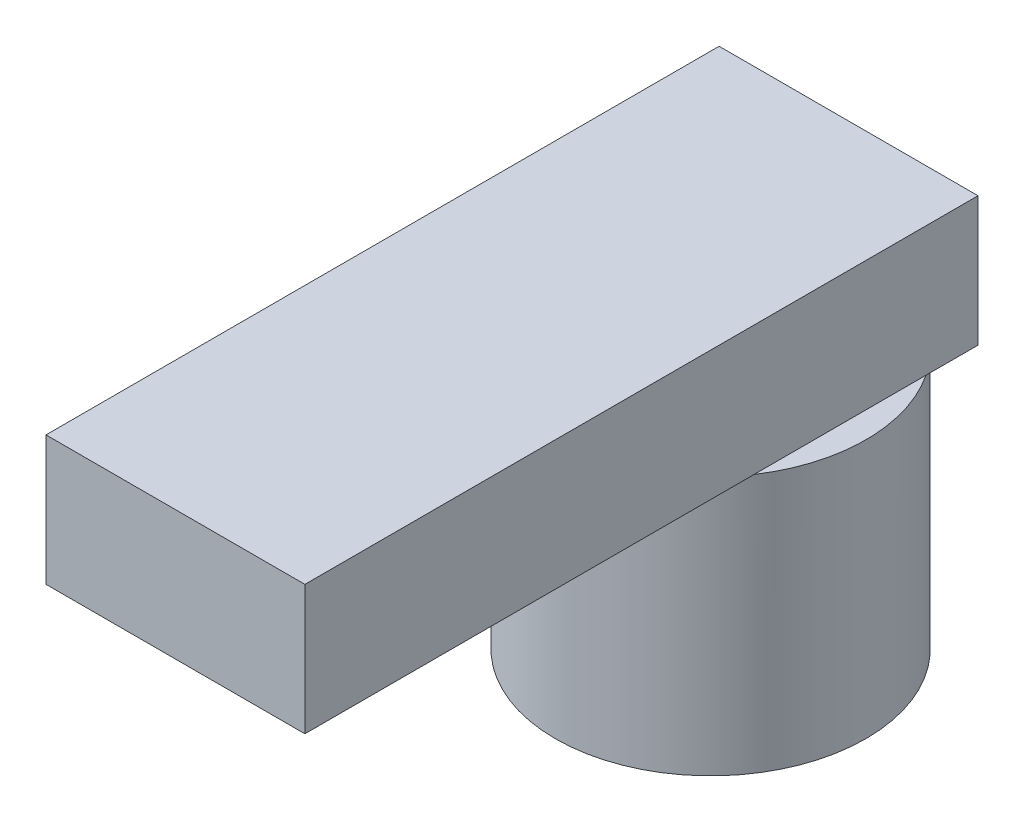
ISO-10303-21;
HEADER;
FILE_DESCRIPTION(('STEP AP214'),'2;1');
FILE_NAME('part.step','',(''),(''),'','','');
FILE_SCHEMA(('AUTOMOTIVE_DESIGN { 1 0 10303 214 1 1 1 1 }'));
ENDSEC;
DATA;
#1=APPLICATION_CONTEXT('core data for automotive mechanical design processes');
#2=APPLICATION_PROTOCOL_DEFINITION('international standard','automotive_design',2000,#1);
#3=PRODUCT_CONTEXT('',#1,'mechanical');
#4=PRODUCT('Part','Part','',(#3));
#5=PRODUCT_RELATED_PRODUCT_CATEGORY('part','',(#4));
#6=PRODUCT_DEFINITION_FORMATION('','',#4);
#7=PRODUCT_DEFINITION_CONTEXT('part definition',#1,'design');
#8=PRODUCT_DEFINITION('design','',#6,#7);
#9=PRODUCT_DEFINITION_SHAPE('','',#8);
#10=(LENGTH_UNIT() NAMED_UNIT(*) SI_UNIT(.MILLI.,.METRE.));
#11=(NAMED_UNIT(*) PLANE_ANGLE_UNIT() SI_UNIT($,.RADIAN.));
#12=(NAMED_UNIT(*) SI_UNIT($,.STERADIAN.) SOLID_ANGLE_UNIT());
#13=UNCERTAINTY_MEASURE_WITH_UNIT(LENGTH_MEASURE(1.E-05),#10,'distance_accuracy_value','');
#14=(GEOMETRIC_REPRESENTATION_CONTEXT(3) GLOBAL_UNCERTAINTY_ASSIGNED_CONTEXT((#13)) GLOBAL_UNIT_ASSIGNED_CONTEXT((#10,
#11,#12)) REPRESENTATION_CONTEXT('',''));
#15=CARTESIAN_POINT('',(0.,0.,0.));
#16=DIRECTION('',(0.,0.,1.));
#17=DIRECTION('',(1.,0.,0.));
#18=AXIS2_PLACEMENT_3D('',#15,#16,#17);
#19=CARTESIAN_POINT('',(0.,0.,0.));
#20=DIRECTION('',(0.,-1.,0.));
#21=DIRECTION('',(0.,0.,-1.));
#22=AXIS2_PLACEMENT_3D('',#19,#20,#21);
#23=PLANE('',#22);
#24=DIRECTION('',(0.,0.,-1.));
#25=VECTOR('',#24,1.);
#26=CARTESIAN_POINT('',(5.,0.,0.));
#27=LINE('',#26,#25);
#28=CARTESIAN_POINT('',(5.,0.,-11.9940419773017));
#29=VERTEX_POINT('',#28);
#30=CARTESIAN_POINT('',(5.,0.,-13.));
#31=VERTEX_POINT('',#30);
#32=EDGE_CURVE('E117',#29,#31,#27,.T.);
#33=ORIENTED_EDGE('',*,*,#32,.F.);
#34=CARTESIAN_POINT('',(2.5,0.,-10.335729582124));
#35=DIRECTION('',(0.,1.,0.));
#36=DIRECTION('',(0.,0.,1.));
#37=AXIS2_PLACEMENT_3D('',#34,#35,#36);
#38=CIRCLE('',#37,3.);
#39=CARTESIAN_POINT('',(3.8790080276891,0.,-13.));
#40=VERTEX_POINT('',#39);
#41=EDGE_CURVE('E11',#29,#40,#38,.T.);
#42=ORIENTED_EDGE('',*,*,#41,.T.);
#43=DIRECTION('',(-1.,0.,0.));
#44=VECTOR('',#43,1.);
#45=CARTESIAN_POINT('',(0.,0.,-13.));
#46=LINE('',#45,#44);
#47=EDGE_CURVE('E118',#31,#40,#46,.T.);
#48=ORIENTED_EDGE('',*,*,#47,.F.);
#49=EDGE_LOOP('',(#33,#42,#48));
#50=FACE_BOUND('',#49,.T.);
#51=ADVANCED_FACE('F33',(#50),#23,.T.);
#52=CARTESIAN_POINT('',(1.12099197231091,0.,-13.));
#53=VERTEX_POINT('',#52);
#54=CARTESIAN_POINT('',(0.,0.,-13.));
#55=VERTEX_POINT('',#54);
#56=EDGE_CURVE('E81',#53,#55,#46,.T.);
#57=ORIENTED_EDGE('',*,*,#56,.F.);
#58=CARTESIAN_POINT('',(0.,0.,-11.9940419773017));
#59=VERTEX_POINT('',#58);
#60=EDGE_CURVE('E42',#53,#59,#38,.T.);
#61=ORIENTED_EDGE('',*,*,#60,.T.);
#62=DIRECTION('',(0.,0.,1.));
#63=VECTOR('',#62,1.);
#64=CARTESIAN_POINT('',(0.,0.,0.));
#65=LINE('',#64,#63);
#66=EDGE_CURVE('E150',#55,#59,#65,.T.);
#67=ORIENTED_EDGE('',*,*,#66,.F.);
#68=EDGE_LOOP('',(#57,#61,#67));
#69=FACE_BOUND('',#68,.T.);
#70=ADVANCED_FACE('F171',(#69),#23,.T.);
#71=CARTESIAN_POINT('',(0.,2.5,0.));
#72=DIRECTION('',(1.,0.,0.));
#73=DIRECTION('',(0.,0.,-1.));
#74=AXIS2_PLACEMENT_3D('',#71,#72,#73);
#75=PLANE('',#74);
#76=ORIENTED_EDGE('',*,*,#66,.T.);
#77=CARTESIAN_POINT('',(0.,0.,-8.67741718694633));
#78=VERTEX_POINT('',#77);
#79=EDGE_CURVE('E152',#59,#78,#65,.T.);
#80=ORIENTED_EDGE('',*,*,#79,.T.);
#81=CARTESIAN_POINT('',(0.,0.,0.));
#82=VERTEX_POINT('',#81);
#83=EDGE_CURVE('E153',#78,#82,#65,.T.);
#84=ORIENTED_EDGE('',*,*,#83,.T.);
#85=DIRECTION('',(0.,-1.,0.));
#86=VECTOR('',#85,1.);
#87=CARTESIAN_POINT('',(0.,2.5,0.));
#88=LINE('',#87,#86);
#89=CARTESIAN_POINT('',(0.,2.5,0.));
#90=VERTEX_POINT('',#89);
#91=EDGE_CURVE('E37',#90,#82,#88,.T.);
#92=ORIENTED_EDGE('',*,*,#91,.F.);
#93=DIRECTION('',(0.,0.,1.));
#94=VECTOR('',#93,1.);
#95=CARTESIAN_POINT('',(0.,2.5,0.));
#96=LINE('',#95,#94);
#97=CARTESIAN_POINT('',(0.,2.5,-13.));
#98=VERTEX_POINT('',#97);
#99=EDGE_CURVE('E133',#98,#90,#96,.T.);
#100=ORIENTED_EDGE('',*,*,#99,.F.);
#101=DIRECTION('',(0.,-1.,0.));
#102=VECTOR('',#101,1.);
#103=CARTESIAN_POINT('',(0.,2.5,-13.));
#104=LINE('',#103,#102);
#105=EDGE_CURVE('E135',#98,#55,#104,.T.);
#106=ORIENTED_EDGE('',*,*,#105,.T.);
#107=EDGE_LOOP('',(#76,#80,#84,#92,#100,#106));
#108=FACE_BOUND('',#107,.T.);
#109=ADVANCED_FACE('F35',(#108),#75,.F.);
#110=CARTESIAN_POINT('',(0.,2.5,0.));
#111=DIRECTION('',(0.,0.,-1.));
#112=DIRECTION('',(-1.,0.,0.));
#113=AXIS2_PLACEMENT_3D('',#110,#111,#112);
#114=PLANE('',#113);
#115=DIRECTION('',(1.,0.,0.));
#116=VECTOR('',#115,1.);
#117=CARTESIAN_POINT('',(0.,0.,0.));
#118=LINE('',#117,#116);
#119=CARTESIAN_POINT('',(5.,0.,0.));
#120=VERTEX_POINT('',#119);
#121=EDGE_CURVE('E122',#82,#120,#118,.T.);
#122=ORIENTED_EDGE('',*,*,#121,.T.);
#123=DIRECTION('',(0.,-1.,0.));
#124=VECTOR('',#123,1.);
#125=CARTESIAN_POINT('',(5.,2.5,0.));
#126=LINE('',#125,#124);
#127=CARTESIAN_POINT('',(5.,2.5,0.));
#128=VERTEX_POINT('',#127);
#129=EDGE_CURVE('E138',#128,#120,#126,.T.);
#130=ORIENTED_EDGE('',*,*,#129,.F.);
#131=DIRECTION('',(1.,0.,0.));
#132=VECTOR('',#131,1.);
#133=CARTESIAN_POINT('',(0.,2.5,0.));
#134=LINE('',#133,#132);
#135=EDGE_CURVE('E89',#90,#128,#134,.T.);
#136=ORIENTED_EDGE('',*,*,#135,.F.);
#137=ORIENTED_EDGE('',*,*,#91,.T.);
#138=EDGE_LOOP('',(#122,#130,#136,#137));
#139=FACE_BOUND('',#138,.T.);
#140=ADVANCED_FACE('F254',(#139),#114,.F.);
#141=CARTESIAN_POINT('',(5.,2.5,0.));
#142=DIRECTION('',(-1.,0.,0.));
#143=DIRECTION('',(0.,0.,1.));
#144=AXIS2_PLACEMENT_3D('',#141,#142,#143);
#145=PLANE('',#144);
#146=CARTESIAN_POINT('',(5.,0.,-8.67741718694633));
#147=VERTEX_POINT('',#146);
#148=EDGE_CURVE('E124',#120,#147,#27,.T.);
#149=ORIENTED_EDGE('',*,*,#148,.T.);
#150=EDGE_CURVE('E112',#147,#29,#27,.T.);
#151=ORIENTED_EDGE('',*,*,#150,.T.);
#152=ORIENTED_EDGE('',*,*,#32,.T.);
#153=DIRECTION('',(0.,-1.,0.));
#154=VECTOR('',#153,1.);
#155=CARTESIAN_POINT('',(5.,2.5,-13.));
#156=LINE('',#155,#154);
#157=CARTESIAN_POINT('',(5.,2.5,-13.));
#158=VERTEX_POINT('',#157);
#159=EDGE_CURVE('E137',#158,#31,#156,.T.);
#160=ORIENTED_EDGE('',*,*,#159,.F.);
#161=DIRECTION('',(0.,0.,-1.));
#162=VECTOR('',#161,1.);
#163=CARTESIAN_POINT('',(5.,2.5,0.));
#164=LINE('',#163,#162);
#165=EDGE_CURVE('E148',#128,#158,#164,.T.);
#166=ORIENTED_EDGE('',*,*,#165,.F.);
#167=ORIENTED_EDGE('',*,*,#129,.T.);
#168=EDGE_LOOP('',(#149,#151,#152,#160,#166,#167));
#169=FACE_BOUND('',#168,.T.);
#170=ADVANCED_FACE('F126',(#169),#145,.F.);
#171=CARTESIAN_POINT('',(0.,2.5,-13.));
#172=DIRECTION('',(0.,0.,1.));
#173=DIRECTION('',(1.,0.,0.));
#174=AXIS2_PLACEMENT_3D('',#171,#172,#173);
#175=PLANE('',#174);
#176=ORIENTED_EDGE('',*,*,#47,.T.);
#177=EDGE_CURVE('E134',#40,#53,#46,.T.);
#178=ORIENTED_EDGE('',*,*,#177,.T.);
#179=ORIENTED_EDGE('',*,*,#56,.T.);
#180=ORIENTED_EDGE('',*,*,#105,.F.);
#181=DIRECTION('',(-1.,0.,0.));
#182=VECTOR('',#181,1.);
#183=CARTESIAN_POINT('',(0.,2.5,-13.));
#184=LINE('',#183,#182);
#185=EDGE_CURVE('E60',#158,#98,#184,.T.);
#186=ORIENTED_EDGE('',*,*,#185,.F.);
#187=ORIENTED_EDGE('',*,*,#159,.T.);
#188=EDGE_LOOP('',(#176,#178,#179,#180,#186,#187));
#189=FACE_BOUND('',#188,.T.);
#190=ADVANCED_FACE('F189',(#189),#175,.F.);
#191=CARTESIAN_POINT('',(0.,2.5,0.));
#192=DIRECTION('',(0.,-1.,0.));
#193=DIRECTION('',(0.,0.,-1.));
#194=AXIS2_PLACEMENT_3D('',#191,#192,#193);
#195=PLANE('',#194);
#196=ORIENTED_EDGE('',*,*,#99,.T.);
#197=ORIENTED_EDGE('',*,*,#135,.T.);
#198=ORIENTED_EDGE('',*,*,#165,.T.);
#199=ORIENTED_EDGE('',*,*,#185,.T.);
#200=EDGE_LOOP('',(#196,#197,#198,#199));
#201=FACE_BOUND('',#200,.T.);
#202=ADVANCED_FACE('F182',(#201),#195,.F.);
#203=ORIENTED_EDGE('',*,*,#83,.F.);
#204=EDGE_CURVE('E116',#78,#147,#38,.T.);
#205=ORIENTED_EDGE('',*,*,#204,.T.);
#206=ORIENTED_EDGE('',*,*,#148,.F.);
#207=ORIENTED_EDGE('',*,*,#121,.F.);
#208=EDGE_LOOP('',(#203,#205,#206,#207));
#209=FACE_BOUND('',#208,.T.);
#210=ADVANCED_FACE('F173',(#209),#23,.T.);
#211=CARTESIAN_POINT('',(2.5,0.,-10.335729582124));
#212=DIRECTION('',(0.,1.,0.));
#213=DIRECTION('',(0.,0.,1.));
#214=AXIS2_PLACEMENT_3D('',#211,#212,#213);
#215=PLANE('',#214);
#216=ORIENTED_EDGE('',*,*,#79,.F.);
#217=EDGE_CURVE('E115',#59,#78,#38,.T.);
#218=ORIENTED_EDGE('',*,*,#217,.T.);
#219=EDGE_LOOP('',(#216,#218));
#220=FACE_BOUND('',#219,.T.);
#221=ADVANCED_FACE('F181',(#220),#215,.T.);
#222=ORIENTED_EDGE('',*,*,#177,.F.);
#223=EDGE_CURVE('E44',#40,#53,#38,.T.);
#224=ORIENTED_EDGE('',*,*,#223,.T.);
#225=EDGE_LOOP('',(#222,#224));
#226=FACE_BOUND('',#225,.T.);
#227=ADVANCED_FACE('F187',(#226),#215,.T.);
#228=ORIENTED_EDGE('',*,*,#150,.F.);
#229=EDGE_CURVE('E51',#147,#29,#38,.T.);
#230=ORIENTED_EDGE('',*,*,#229,.T.);
#231=EDGE_LOOP('',(#228,#230));
#232=FACE_BOUND('',#231,.T.);
#233=ADVANCED_FACE('F110',(#232),#215,.T.);
#234=CARTESIAN_POINT('',(2.5,-5.,-10.335729582124));
#235=DIRECTION('',(0.,1.,0.));
#236=DIRECTION('',(0.,0.,1.));
#237=AXIS2_PLACEMENT_3D('',#234,#235,#236);
#238=CYLINDRICAL_SURFACE('',#237,3.);
#239=CARTESIAN_POINT('',(2.5,-5.,-10.335729582124));
#240=DIRECTION('',(0.,1.,0.));
#241=DIRECTION('',(0.,0.,1.));
#242=AXIS2_PLACEMENT_3D('',#239,#240,#241);
#243=CIRCLE('',#242,3.);
#244=CARTESIAN_POINT('',(2.5,-5.,-7.33572958212403));
#245=VERTEX_POINT('',#244);
#246=EDGE_CURVE('E114',#245,#245,#243,.T.);
#247=ORIENTED_EDGE('',*,*,#246,.T.);
#248=EDGE_LOOP('',(#247));
#249=FACE_BOUND('',#248,.T.);
#250=ORIENTED_EDGE('',*,*,#229,.F.);
#251=ORIENTED_EDGE('',*,*,#204,.F.);
#252=ORIENTED_EDGE('',*,*,#217,.F.);
#253=ORIENTED_EDGE('',*,*,#60,.F.);
#254=ORIENTED_EDGE('',*,*,#223,.F.);
#255=ORIENTED_EDGE('',*,*,#41,.F.);
#256=EDGE_LOOP('',(#250,#251,#252,#253,#254,#255));
#257=FACE_BOUND('',#256,.T.);
#258=ADVANCED_FACE('F103',(#249,#257),#238,.T.);
#259=CARTESIAN_POINT('',(2.5,-5.,-10.335729582124));
#260=DIRECTION('',(0.,1.,0.));
#261=DIRECTION('',(0.,0.,1.));
#262=AXIS2_PLACEMENT_3D('',#259,#260,#261);
#263=PLANE('',#262);
#264=ORIENTED_EDGE('',*,*,#246,.F.);
#265=EDGE_LOOP('',(#264));
#266=FACE_BOUND('',#265,.T.);
#267=ADVANCED_FACE('F162',(#266),#263,.F.);
#268=CLOSED_SHELL('',(#51,#70,#109,#140,#170,#190,#202,#210,#221,#227,#233,#258,#267));
#269=MANIFOLD_SOLID_BREP('B2',#268);
#270=ADVANCED_BREP_SHAPE_REPRESENTATION('',(#18,#269),#14);
#271=SHAPE_DEFINITION_REPRESENTATION(#9,#270);
ENDSEC;
END-ISO-10303-21;
